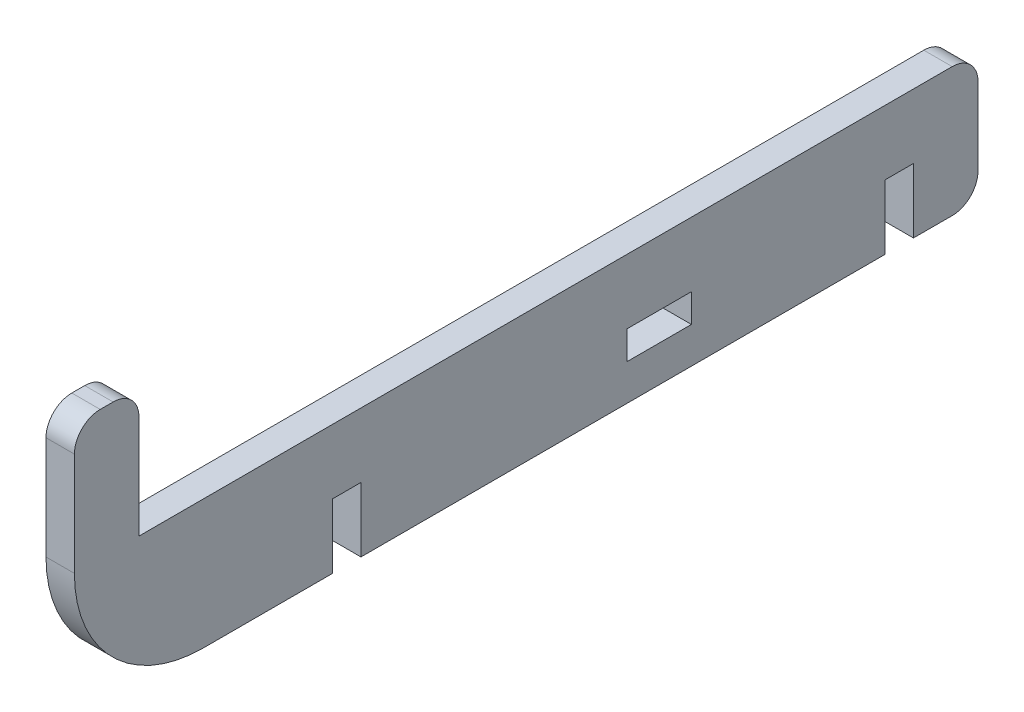
ISO-10303-21;
HEADER;
FILE_DESCRIPTION(('STEP AP214'),'2;1');
FILE_NAME('part.step','',(''),(''),'','','');
FILE_SCHEMA(('AUTOMOTIVE_DESIGN { 1 0 10303 214 1 1 1 1 }'));
ENDSEC;
DATA;
#1=APPLICATION_CONTEXT('core data for automotive mechanical design processes');
#2=APPLICATION_PROTOCOL_DEFINITION('international standard','automotive_design',2000,#1);
#3=PRODUCT_CONTEXT('',#1,'mechanical');
#4=PRODUCT('Part','Part','',(#3));
#5=PRODUCT_RELATED_PRODUCT_CATEGORY('part','',(#4));
#6=PRODUCT_DEFINITION_FORMATION('','',#4);
#7=PRODUCT_DEFINITION_CONTEXT('part definition',#1,'design');
#8=PRODUCT_DEFINITION('design','',#6,#7);
#9=PRODUCT_DEFINITION_SHAPE('','',#8);
#10=(LENGTH_UNIT() NAMED_UNIT(*) SI_UNIT(.MILLI.,.METRE.));
#11=(NAMED_UNIT(*) PLANE_ANGLE_UNIT() SI_UNIT($,.RADIAN.));
#12=(NAMED_UNIT(*) SI_UNIT($,.STERADIAN.) SOLID_ANGLE_UNIT());
#13=UNCERTAINTY_MEASURE_WITH_UNIT(LENGTH_MEASURE(1.E-05),#10,'distance_accuracy_value','');
#14=(GEOMETRIC_REPRESENTATION_CONTEXT(3) GLOBAL_UNCERTAINTY_ASSIGNED_CONTEXT((#13)) GLOBAL_UNIT_ASSIGNED_CONTEXT((#10,
#11,#12)) REPRESENTATION_CONTEXT('',''));
#15=CARTESIAN_POINT('',(0.,0.,0.));
#16=DIRECTION('',(0.,0.,1.));
#17=DIRECTION('',(1.,0.,0.));
#18=AXIS2_PLACEMENT_3D('',#15,#16,#17);
#19=CARTESIAN_POINT('',(2.794,0.,0.));
#20=DIRECTION('',(0.,1.,0.));
#21=DIRECTION('',(0.,0.,1.));
#22=AXIS2_PLACEMENT_3D('',#19,#20,#21);
#23=PLANE('',#22);
#24=DIRECTION('',(0.,0.,-1.));
#25=VECTOR('',#24,1.);
#26=CARTESIAN_POINT('',(0.,0.,0.));
#27=LINE('',#26,#25);
#28=CARTESIAN_POINT('',(0.,0.,-28.194));
#29=VERTEX_POINT('',#28);
#30=CARTESIAN_POINT('',(0.,0.,-79.756));
#31=VERTEX_POINT('',#30);
#32=EDGE_CURVE('E304',#29,#31,#27,.T.);
#33=ORIENTED_EDGE('',*,*,#32,.T.);
#34=DIRECTION('',(-1.,0.,0.));
#35=VECTOR('',#34,1.);
#36=CARTESIAN_POINT('',(2.794,0.,-79.756));
#37=LINE('',#36,#35);
#38=CARTESIAN_POINT('',(2.794,0.,-79.756));
#39=VERTEX_POINT('',#38);
#40=EDGE_CURVE('E240',#39,#31,#37,.T.);
#41=ORIENTED_EDGE('',*,*,#40,.F.);
#42=DIRECTION('',(0.,0.,-1.));
#43=VECTOR('',#42,1.);
#44=CARTESIAN_POINT('',(2.794,0.,0.));
#45=LINE('',#44,#43);
#46=CARTESIAN_POINT('',(2.794,0.,-28.194));
#47=VERTEX_POINT('',#46);
#48=EDGE_CURVE('E285',#47,#39,#45,.T.);
#49=ORIENTED_EDGE('',*,*,#48,.F.);
#50=DIRECTION('',(-1.,0.,0.));
#51=VECTOR('',#50,1.);
#52=CARTESIAN_POINT('',(2.794,0.,-28.194));
#53=LINE('',#52,#51);
#54=EDGE_CURVE('E267',#47,#29,#53,.T.);
#55=ORIENTED_EDGE('',*,*,#54,.T.);
#56=EDGE_LOOP('',(#33,#41,#49,#55));
#57=FACE_BOUND('',#56,.T.);
#58=ADVANCED_FACE('F33',(#57),#23,.F.);
#59=CARTESIAN_POINT('',(2.794,0.,-82.55));
#60=VERTEX_POINT('',#59);
#61=CARTESIAN_POINT('',(2.794,0.,-86.36));
#62=VERTEX_POINT('',#61);
#63=EDGE_CURVE('E279',#60,#62,#45,.T.);
#64=ORIENTED_EDGE('',*,*,#63,.F.);
#65=DIRECTION('',(-1.,0.,0.));
#66=VECTOR('',#65,1.);
#67=CARTESIAN_POINT('',(2.794,0.,-82.55));
#68=LINE('',#67,#66);
#69=CARTESIAN_POINT('',(0.,0.,-82.55));
#70=VERTEX_POINT('',#69);
#71=EDGE_CURVE('E243',#60,#70,#68,.T.);
#72=ORIENTED_EDGE('',*,*,#71,.T.);
#73=CARTESIAN_POINT('',(0.,0.,-86.36));
#74=VERTEX_POINT('',#73);
#75=EDGE_CURVE('E299',#70,#74,#27,.T.);
#76=ORIENTED_EDGE('',*,*,#75,.T.);
#77=DIRECTION('',(-1.,0.,0.));
#78=VECTOR('',#77,1.);
#79=CARTESIAN_POINT('',(2.794,0.,-86.36));
#80=LINE('',#79,#78);
#81=EDGE_CURVE('E330',#74,#62,#80,.F.);
#82=ORIENTED_EDGE('',*,*,#81,.T.);
#83=EDGE_LOOP('',(#64,#72,#76,#82));
#84=FACE_BOUND('',#83,.T.);
#85=ADVANCED_FACE('F397',(#84),#23,.F.);
#86=CARTESIAN_POINT('',(2.794,25.4,0.));
#87=DIRECTION('',(0.,0.,-1.));
#88=DIRECTION('',(-1.,0.,0.));
#89=AXIS2_PLACEMENT_3D('',#86,#87,#88);
#90=PLANE('',#89);
#91=DIRECTION('',(0.,-1.,0.));
#92=VECTOR('',#91,1.);
#93=CARTESIAN_POINT('',(0.,25.4,0.));
#94=LINE('',#93,#92);
#95=CARTESIAN_POINT('',(0.,22.86,0.));
#96=VERTEX_POINT('',#95);
#97=CARTESIAN_POINT('',(0.,12.7,0.));
#98=VERTEX_POINT('',#97);
#99=EDGE_CURVE('E270',#96,#98,#94,.T.);
#100=ORIENTED_EDGE('',*,*,#99,.T.);
#101=DIRECTION('',(-1.,0.,0.));
#102=VECTOR('',#101,1.);
#103=CARTESIAN_POINT('',(2.794,12.7,0.));
#104=LINE('',#103,#102);
#105=CARTESIAN_POINT('',(2.794,12.7,0.));
#106=VERTEX_POINT('',#105);
#107=EDGE_CURVE('E41',#98,#106,#104,.F.);
#108=ORIENTED_EDGE('',*,*,#107,.T.);
#109=DIRECTION('',(0.,-1.,0.));
#110=VECTOR('',#109,1.);
#111=CARTESIAN_POINT('',(2.794,25.4,0.));
#112=LINE('',#111,#110);
#113=CARTESIAN_POINT('',(2.794,22.86,0.));
#114=VERTEX_POINT('',#113);
#115=EDGE_CURVE('E276',#114,#106,#112,.T.);
#116=ORIENTED_EDGE('',*,*,#115,.F.);
#117=DIRECTION('',(-1.,0.,0.));
#118=VECTOR('',#117,1.);
#119=CARTESIAN_POINT('',(2.794,22.86,0.));
#120=LINE('',#119,#118);
#121=EDGE_CURVE('E351',#114,#96,#120,.T.);
#122=ORIENTED_EDGE('',*,*,#121,.T.);
#123=EDGE_LOOP('',(#100,#108,#116,#122));
#124=FACE_BOUND('',#123,.T.);
#125=ADVANCED_FACE('F361',(#124),#90,.F.);
#126=CARTESIAN_POINT('',(0.,0.,-12.7));
#127=VERTEX_POINT('',#126);
#128=CARTESIAN_POINT('',(0.,0.,-25.4));
#129=VERTEX_POINT('',#128);
#130=EDGE_CURVE('E300',#127,#129,#27,.T.);
#131=ORIENTED_EDGE('',*,*,#130,.T.);
#132=DIRECTION('',(-1.,0.,0.));
#133=VECTOR('',#132,1.);
#134=CARTESIAN_POINT('',(2.794,0.,-25.4));
#135=LINE('',#134,#133);
#136=CARTESIAN_POINT('',(2.794,0.,-25.4));
#137=VERTEX_POINT('',#136);
#138=EDGE_CURVE('E260',#137,#129,#135,.T.);
#139=ORIENTED_EDGE('',*,*,#138,.F.);
#140=CARTESIAN_POINT('',(2.794,0.,-12.7));
#141=VERTEX_POINT('',#140);
#142=EDGE_CURVE('E281',#141,#137,#45,.T.);
#143=ORIENTED_EDGE('',*,*,#142,.F.);
#144=DIRECTION('',(-1.,0.,0.));
#145=VECTOR('',#144,1.);
#146=CARTESIAN_POINT('',(2.794,0.,-12.7));
#147=LINE('',#146,#145);
#148=EDGE_CURVE('E354',#141,#127,#147,.T.);
#149=ORIENTED_EDGE('',*,*,#148,.T.);
#150=EDGE_LOOP('',(#131,#139,#143,#149));
#151=FACE_BOUND('',#150,.T.);
#152=ADVANCED_FACE('F371',(#151),#23,.F.);
#153=CARTESIAN_POINT('',(2.794,0.,-88.9));
#154=DIRECTION('',(0.,0.,1.));
#155=DIRECTION('',(1.,0.,0.));
#156=AXIS2_PLACEMENT_3D('',#153,#154,#155);
#157=PLANE('',#156);
#158=DIRECTION('',(0.,1.,0.));
#159=VECTOR('',#158,1.);
#160=CARTESIAN_POINT('',(2.794,0.,-88.9));
#161=LINE('',#160,#159);
#162=CARTESIAN_POINT('',(2.794,2.54,-88.9));
#163=VERTEX_POINT('',#162);
#164=CARTESIAN_POINT('',(2.794,10.16,-88.9));
#165=VERTEX_POINT('',#164);
#166=EDGE_CURVE('E284',#163,#165,#161,.T.);
#167=ORIENTED_EDGE('',*,*,#166,.F.);
#168=DIRECTION('',(-1.,0.,0.));
#169=VECTOR('',#168,1.);
#170=CARTESIAN_POINT('',(2.794,2.54,-88.9));
#171=LINE('',#170,#169);
#172=CARTESIAN_POINT('',(0.,2.54,-88.9));
#173=VERTEX_POINT('',#172);
#174=EDGE_CURVE('E318',#163,#173,#171,.T.);
#175=ORIENTED_EDGE('',*,*,#174,.T.);
#176=DIRECTION('',(0.,1.,0.));
#177=VECTOR('',#176,1.);
#178=CARTESIAN_POINT('',(0.,0.,-88.9));
#179=LINE('',#178,#177);
#180=CARTESIAN_POINT('',(0.,10.16,-88.9));
#181=VERTEX_POINT('',#180);
#182=EDGE_CURVE('E303',#173,#181,#179,.T.);
#183=ORIENTED_EDGE('',*,*,#182,.T.);
#184=DIRECTION('',(-1.,0.,0.));
#185=VECTOR('',#184,1.);
#186=CARTESIAN_POINT('',(2.794,10.16,-88.9));
#187=LINE('',#186,#185);
#188=EDGE_CURVE('E316',#181,#165,#187,.F.);
#189=ORIENTED_EDGE('',*,*,#188,.T.);
#190=EDGE_LOOP('',(#167,#175,#183,#189));
#191=FACE_BOUND('',#190,.T.);
#192=ADVANCED_FACE('F408',(#191),#157,.F.);
#193=CARTESIAN_POINT('',(2.794,12.7,-88.9));
#194=DIRECTION('',(0.,-1.,0.));
#195=DIRECTION('',(0.,0.,-1.));
#196=AXIS2_PLACEMENT_3D('',#193,#194,#195);
#197=PLANE('',#196);
#198=DIRECTION('',(0.,0.,1.));
#199=VECTOR('',#198,1.);
#200=CARTESIAN_POINT('',(2.794,12.7,-88.9));
#201=LINE('',#200,#199);
#202=CARTESIAN_POINT('',(2.794,12.7,-86.36));
#203=VERTEX_POINT('',#202);
#204=CARTESIAN_POINT('',(2.794,12.7,-6.35));
#205=VERTEX_POINT('',#204);
#206=EDGE_CURVE('E288',#203,#205,#201,.T.);
#207=ORIENTED_EDGE('',*,*,#206,.F.);
#208=DIRECTION('',(-1.,0.,0.));
#209=VECTOR('',#208,1.);
#210=CARTESIAN_POINT('',(2.794,12.7,-86.36));
#211=LINE('',#210,#209);
#212=CARTESIAN_POINT('',(0.,12.7,-86.36));
#213=VERTEX_POINT('',#212);
#214=EDGE_CURVE('E341',#203,#213,#211,.T.);
#215=ORIENTED_EDGE('',*,*,#214,.T.);
#216=DIRECTION('',(0.,0.,1.));
#217=VECTOR('',#216,1.);
#218=CARTESIAN_POINT('',(0.,12.7,-88.9));
#219=LINE('',#218,#217);
#220=CARTESIAN_POINT('',(0.,12.7,-6.35));
#221=VERTEX_POINT('',#220);
#222=EDGE_CURVE('E307',#213,#221,#219,.T.);
#223=ORIENTED_EDGE('',*,*,#222,.T.);
#224=DIRECTION('',(-1.,0.,0.));
#225=VECTOR('',#224,1.);
#226=CARTESIAN_POINT('',(2.794,12.7,-6.35));
#227=LINE('',#226,#225);
#228=EDGE_CURVE('E296',#205,#221,#227,.T.);
#229=ORIENTED_EDGE('',*,*,#228,.F.);
#230=EDGE_LOOP('',(#207,#215,#223,#229));
#231=FACE_BOUND('',#230,.T.);
#232=ADVANCED_FACE('F416',(#231),#197,.F.);
#233=CARTESIAN_POINT('',(2.794,12.7,-6.35));
#234=DIRECTION('',(0.,0.,1.));
#235=DIRECTION('',(0.,-1.,0.));
#236=AXIS2_PLACEMENT_3D('',#233,#234,#235);
#237=PLANE('',#236);
#238=DIRECTION('',(0.,1.,0.));
#239=VECTOR('',#238,1.);
#240=CARTESIAN_POINT('',(0.,12.7,-6.35));
#241=LINE('',#240,#239);
#242=CARTESIAN_POINT('',(0.,22.86,-6.35));
#243=VERTEX_POINT('',#242);
#244=EDGE_CURVE('E309',#221,#243,#241,.T.);
#245=ORIENTED_EDGE('',*,*,#244,.T.);
#246=DIRECTION('',(-1.,0.,0.));
#247=VECTOR('',#246,1.);
#248=CARTESIAN_POINT('',(2.794,22.86,-6.35));
#249=LINE('',#248,#247);
#250=CARTESIAN_POINT('',(2.794,22.86,-6.35));
#251=VERTEX_POINT('',#250);
#252=EDGE_CURVE('E349',#243,#251,#249,.F.);
#253=ORIENTED_EDGE('',*,*,#252,.T.);
#254=DIRECTION('',(0.,1.,0.));
#255=VECTOR('',#254,1.);
#256=CARTESIAN_POINT('',(2.794,12.7,-6.35));
#257=LINE('',#256,#255);
#258=EDGE_CURVE('E290',#205,#251,#257,.T.);
#259=ORIENTED_EDGE('',*,*,#258,.F.);
#260=ORIENTED_EDGE('',*,*,#228,.T.);
#261=EDGE_LOOP('',(#245,#253,#259,#260));
#262=FACE_BOUND('',#261,.T.);
#263=ADVANCED_FACE('F421',(#262),#237,.F.);
#264=CARTESIAN_POINT('',(2.794,25.4,-6.35));
#265=DIRECTION('',(0.,-1.,0.));
#266=DIRECTION('',(0.,0.,-1.));
#267=AXIS2_PLACEMENT_3D('',#264,#265,#266);
#268=PLANE('',#267);
#269=DIRECTION('',(0.,0.,1.));
#270=VECTOR('',#269,1.);
#271=CARTESIAN_POINT('',(2.794,25.4,-6.35));
#272=LINE('',#271,#270);
#273=CARTESIAN_POINT('',(2.794,25.4,-3.81));
#274=VERTEX_POINT('',#273);
#275=CARTESIAN_POINT('',(2.794,25.4,-2.54));
#276=VERTEX_POINT('',#275);
#277=EDGE_CURVE('E293',#274,#276,#272,.T.);
#278=ORIENTED_EDGE('',*,*,#277,.F.);
#279=DIRECTION('',(-1.,0.,0.));
#280=VECTOR('',#279,1.);
#281=CARTESIAN_POINT('',(2.794,25.4,-3.81));
#282=LINE('',#281,#280);
#283=CARTESIAN_POINT('',(0.,25.4,-3.81));
#284=VERTEX_POINT('',#283);
#285=EDGE_CURVE('E346',#274,#284,#282,.T.);
#286=ORIENTED_EDGE('',*,*,#285,.T.);
#287=DIRECTION('',(0.,0.,1.));
#288=VECTOR('',#287,1.);
#289=CARTESIAN_POINT('',(0.,25.4,-6.35));
#290=LINE('',#289,#288);
#291=CARTESIAN_POINT('',(0.,25.4,-2.54));
#292=VERTEX_POINT('',#291);
#293=EDGE_CURVE('E280',#284,#292,#290,.T.);
#294=ORIENTED_EDGE('',*,*,#293,.T.);
#295=DIRECTION('',(-1.,0.,0.));
#296=VECTOR('',#295,1.);
#297=CARTESIAN_POINT('',(2.794,25.4,-2.54));
#298=LINE('',#297,#296);
#299=EDGE_CURVE('E344',#292,#276,#298,.F.);
#300=ORIENTED_EDGE('',*,*,#299,.T.);
#301=EDGE_LOOP('',(#278,#286,#294,#300));
#302=FACE_BOUND('',#301,.T.);
#303=ADVANCED_FACE('F430',(#302),#268,.F.);
#304=CARTESIAN_POINT('',(2.794,0.,0.));
#305=DIRECTION('',(1.,0.,0.));
#306=DIRECTION('',(0.,0.,-1.));
#307=AXIS2_PLACEMENT_3D('',#304,#305,#306);
#308=PLANE('',#307);
#309=DIRECTION('',(0.,-1.,0.));
#310=VECTOR('',#309,1.);
#311=CARTESIAN_POINT('',(2.794,6.35,-60.706));
#312=LINE('',#311,#310);
#313=CARTESIAN_POINT('',(2.794,6.35,-60.706));
#314=VERTEX_POINT('',#313);
#315=CARTESIAN_POINT('',(2.794,3.556,-60.706));
#316=VERTEX_POINT('',#315);
#317=EDGE_CURVE('E189',#314,#316,#312,.T.);
#318=ORIENTED_EDGE('',*,*,#317,.T.);
#319=DIRECTION('',(0.,0.,1.));
#320=VECTOR('',#319,1.);
#321=CARTESIAN_POINT('',(2.794,3.556,-60.706));
#322=LINE('',#321,#320);
#323=CARTESIAN_POINT('',(2.794,3.556,-54.356));
#324=VERTEX_POINT('',#323);
#325=EDGE_CURVE('E198',#316,#324,#322,.T.);
#326=ORIENTED_EDGE('',*,*,#325,.T.);
#327=DIRECTION('',(0.,1.,0.));
#328=VECTOR('',#327,1.);
#329=CARTESIAN_POINT('',(2.794,3.556,-54.356));
#330=LINE('',#329,#328);
#331=CARTESIAN_POINT('',(2.794,6.35,-54.356));
#332=VERTEX_POINT('',#331);
#333=EDGE_CURVE('E48',#324,#332,#330,.T.);
#334=ORIENTED_EDGE('',*,*,#333,.T.);
#335=DIRECTION('',(0.,0.,-1.));
#336=VECTOR('',#335,1.);
#337=CARTESIAN_POINT('',(2.794,6.35,-54.356));
#338=LINE('',#337,#336);
#339=EDGE_CURVE('E195',#332,#314,#338,.T.);
#340=ORIENTED_EDGE('',*,*,#339,.T.);
#341=EDGE_LOOP('',(#318,#326,#334,#340));
#342=FACE_BOUND('',#341,.T.);
#343=DIRECTION('',(0.,1.,0.));
#344=VECTOR('',#343,1.);
#345=CARTESIAN_POINT('',(2.794,0.,-79.756));
#346=LINE('',#345,#344);
#347=CARTESIAN_POINT('',(2.794,6.34999999999999,-79.756));
#348=VERTEX_POINT('',#347);
#349=EDGE_CURVE('E224',#39,#348,#346,.T.);
#350=ORIENTED_EDGE('',*,*,#349,.T.);
#351=DIRECTION('',(0.,0.,-1.));
#352=VECTOR('',#351,1.);
#353=CARTESIAN_POINT('',(2.794,6.34999999999999,-79.756));
#354=LINE('',#353,#352);
#355=CARTESIAN_POINT('',(2.794,6.34999999999998,-82.55));
#356=VERTEX_POINT('',#355);
#357=EDGE_CURVE('E227',#348,#356,#354,.T.);
#358=ORIENTED_EDGE('',*,*,#357,.T.);
#359=DIRECTION('',(0.,-1.,0.));
#360=VECTOR('',#359,1.);
#361=CARTESIAN_POINT('',(2.794,0.,-82.55));
#362=LINE('',#361,#360);
#363=EDGE_CURVE('E231',#356,#60,#362,.T.);
#364=ORIENTED_EDGE('',*,*,#363,.T.);
#365=ORIENTED_EDGE('',*,*,#63,.T.);
#366=CARTESIAN_POINT('',(2.794,2.54,-86.36));
#367=DIRECTION('',(1.,0.,0.));
#368=DIRECTION('',(0.,0.,-1.));
#369=AXIS2_PLACEMENT_3D('',#366,#367,#368);
#370=CIRCLE('',#369,2.54);
#371=EDGE_CURVE('E339',#62,#163,#370,.T.);
#372=ORIENTED_EDGE('',*,*,#371,.T.);
#373=ORIENTED_EDGE('',*,*,#166,.T.);
#374=CARTESIAN_POINT('',(2.794,10.16,-86.36));
#375=DIRECTION('',(1.,0.,0.));
#376=DIRECTION('',(0.,0.,-1.));
#377=AXIS2_PLACEMENT_3D('',#374,#375,#376);
#378=CIRCLE('',#377,2.54);
#379=EDGE_CURVE('E337',#165,#203,#378,.T.);
#380=ORIENTED_EDGE('',*,*,#379,.T.);
#381=ORIENTED_EDGE('',*,*,#206,.T.);
#382=ORIENTED_EDGE('',*,*,#258,.T.);
#383=CARTESIAN_POINT('',(2.794,22.86,-3.81));
#384=DIRECTION('',(1.,0.,0.));
#385=DIRECTION('',(0.,0.,-1.));
#386=AXIS2_PLACEMENT_3D('',#383,#384,#385);
#387=CIRCLE('',#386,2.54);
#388=EDGE_CURVE('E335',#251,#274,#387,.T.);
#389=ORIENTED_EDGE('',*,*,#388,.T.);
#390=ORIENTED_EDGE('',*,*,#277,.T.);
#391=CARTESIAN_POINT('',(2.794,22.86,-2.54));
#392=DIRECTION('',(1.,0.,0.));
#393=DIRECTION('',(0.,0.,-1.));
#394=AXIS2_PLACEMENT_3D('',#391,#392,#393);
#395=CIRCLE('',#394,2.54);
#396=EDGE_CURVE('E333',#276,#114,#395,.T.);
#397=ORIENTED_EDGE('',*,*,#396,.T.);
#398=ORIENTED_EDGE('',*,*,#115,.T.);
#399=CARTESIAN_POINT('',(2.794,12.7,-12.7));
#400=DIRECTION('',(1.,0.,0.));
#401=DIRECTION('',(0.,0.,-1.));
#402=AXIS2_PLACEMENT_3D('',#399,#400,#401);
#403=CIRCLE('',#402,12.7);
#404=EDGE_CURVE('E11',#106,#141,#403,.T.);
#405=ORIENTED_EDGE('',*,*,#404,.T.);
#406=ORIENTED_EDGE('',*,*,#142,.T.);
#407=DIRECTION('',(0.,1.,0.));
#408=VECTOR('',#407,1.);
#409=CARTESIAN_POINT('',(2.794,0.,-25.4));
#410=LINE('',#409,#408);
#411=CARTESIAN_POINT('',(2.794,6.35,-25.4));
#412=VERTEX_POINT('',#411);
#413=EDGE_CURVE('E250',#137,#412,#410,.T.);
#414=ORIENTED_EDGE('',*,*,#413,.T.);
#415=DIRECTION('',(0.,0.,-1.));
#416=VECTOR('',#415,1.);
#417=CARTESIAN_POINT('',(2.794,6.35,-28.194));
#418=LINE('',#417,#416);
#419=CARTESIAN_POINT('',(2.794,6.35,-28.194));
#420=VERTEX_POINT('',#419);
#421=EDGE_CURVE('E253',#412,#420,#418,.T.);
#422=ORIENTED_EDGE('',*,*,#421,.T.);
#423=DIRECTION('',(0.,-1.,0.));
#424=VECTOR('',#423,1.);
#425=CARTESIAN_POINT('',(2.794,0.,-28.194));
#426=LINE('',#425,#424);
#427=EDGE_CURVE('E257',#420,#47,#426,.T.);
#428=ORIENTED_EDGE('',*,*,#427,.T.);
#429=ORIENTED_EDGE('',*,*,#48,.T.);
#430=EDGE_LOOP('',(#350,#358,#364,#365,#372,#373,#380,#381,#382,#389,#390,#397,#398,#405,#406,
#414,#422,#428,#429));
#431=FACE_BOUND('',#430,.T.);
#432=ADVANCED_FACE('F202',(#342,#431),#308,.T.);
#433=CARTESIAN_POINT('',(0.,0.,0.));
#434=DIRECTION('',(1.,0.,0.));
#435=DIRECTION('',(0.,0.,-1.));
#436=AXIS2_PLACEMENT_3D('',#433,#434,#435);
#437=PLANE('',#436);
#438=DIRECTION('',(0.,0.,1.));
#439=VECTOR('',#438,1.);
#440=CARTESIAN_POINT('',(0.,3.556,-60.706));
#441=LINE('',#440,#439);
#442=CARTESIAN_POINT('',(0.,3.556,-60.706));
#443=VERTEX_POINT('',#442);
#444=CARTESIAN_POINT('',(0.,3.556,-54.356));
#445=VERTEX_POINT('',#444);
#446=EDGE_CURVE('E214',#443,#445,#441,.T.);
#447=ORIENTED_EDGE('',*,*,#446,.F.);
#448=DIRECTION('',(0.,-1.,0.));
#449=VECTOR('',#448,1.);
#450=CARTESIAN_POINT('',(0.,6.35,-60.706));
#451=LINE('',#450,#449);
#452=CARTESIAN_POINT('',(0.,6.35,-60.706));
#453=VERTEX_POINT('',#452);
#454=EDGE_CURVE('E56',#453,#443,#451,.T.);
#455=ORIENTED_EDGE('',*,*,#454,.F.);
#456=DIRECTION('',(0.,0.,-1.));
#457=VECTOR('',#456,1.);
#458=CARTESIAN_POINT('',(0.,6.35,-54.356));
#459=LINE('',#458,#457);
#460=CARTESIAN_POINT('',(0.,6.35,-54.356));
#461=VERTEX_POINT('',#460);
#462=EDGE_CURVE('E205',#461,#453,#459,.T.);
#463=ORIENTED_EDGE('',*,*,#462,.F.);
#464=DIRECTION('',(0.,1.,0.));
#465=VECTOR('',#464,1.);
#466=CARTESIAN_POINT('',(0.,3.556,-54.356));
#467=LINE('',#466,#465);
#468=EDGE_CURVE('E208',#445,#461,#467,.T.);
#469=ORIENTED_EDGE('',*,*,#468,.F.);
#470=EDGE_LOOP('',(#447,#455,#463,#469));
#471=FACE_BOUND('',#470,.T.);
#472=DIRECTION('',(0.,0.,-1.));
#473=VECTOR('',#472,1.);
#474=CARTESIAN_POINT('',(0.,6.34999999999999,-79.756));
#475=LINE('',#474,#473);
#476=CARTESIAN_POINT('',(0.,6.34999999999999,-79.756));
#477=VERTEX_POINT('',#476);
#478=CARTESIAN_POINT('',(0.,6.34999999999998,-82.55));
#479=VERTEX_POINT('',#478);
#480=EDGE_CURVE('E236',#477,#479,#475,.T.);
#481=ORIENTED_EDGE('',*,*,#480,.F.);
#482=DIRECTION('',(0.,1.,0.));
#483=VECTOR('',#482,1.);
#484=CARTESIAN_POINT('',(0.,0.,-79.756));
#485=LINE('',#484,#483);
#486=EDGE_CURVE('E220',#31,#477,#485,.T.);
#487=ORIENTED_EDGE('',*,*,#486,.F.);
#488=ORIENTED_EDGE('',*,*,#32,.F.);
#489=DIRECTION('',(0.,-1.,0.));
#490=VECTOR('',#489,1.);
#491=CARTESIAN_POINT('',(0.,0.,-28.194));
#492=LINE('',#491,#490);
#493=CARTESIAN_POINT('',(0.,6.35,-28.194));
#494=VERTEX_POINT('',#493);
#495=EDGE_CURVE('E254',#494,#29,#492,.T.);
#496=ORIENTED_EDGE('',*,*,#495,.F.);
#497=DIRECTION('',(0.,0.,-1.));
#498=VECTOR('',#497,1.);
#499=CARTESIAN_POINT('',(0.,6.35,-28.194));
#500=LINE('',#499,#498);
#501=CARTESIAN_POINT('',(0.,6.35,-25.4));
#502=VERTEX_POINT('',#501);
#503=EDGE_CURVE('E263',#502,#494,#500,.T.);
#504=ORIENTED_EDGE('',*,*,#503,.F.);
#505=DIRECTION('',(0.,1.,0.));
#506=VECTOR('',#505,1.);
#507=CARTESIAN_POINT('',(0.,0.,-25.4));
#508=LINE('',#507,#506);
#509=EDGE_CURVE('E242',#129,#502,#508,.T.);
#510=ORIENTED_EDGE('',*,*,#509,.F.);
#511=ORIENTED_EDGE('',*,*,#130,.F.);
#512=CARTESIAN_POINT('',(0.,12.7,-12.7));
#513=DIRECTION('',(1.,0.,0.));
#514=DIRECTION('',(0.,0.,-1.));
#515=AXIS2_PLACEMENT_3D('',#512,#513,#514);
#516=CIRCLE('',#515,12.7);
#517=EDGE_CURVE('E357',#127,#98,#516,.F.);
#518=ORIENTED_EDGE('',*,*,#517,.T.);
#519=ORIENTED_EDGE('',*,*,#99,.F.);
#520=CARTESIAN_POINT('',(0.,22.86,-2.54));
#521=DIRECTION('',(1.,0.,0.));
#522=DIRECTION('',(0.,0.,-1.));
#523=AXIS2_PLACEMENT_3D('',#520,#521,#522);
#524=CIRCLE('',#523,2.54);
#525=EDGE_CURVE('E321',#96,#292,#524,.F.);
#526=ORIENTED_EDGE('',*,*,#525,.T.);
#527=ORIENTED_EDGE('',*,*,#293,.F.);
#528=CARTESIAN_POINT('',(0.,22.86,-3.81));
#529=DIRECTION('',(1.,0.,0.));
#530=DIRECTION('',(0.,0.,-1.));
#531=AXIS2_PLACEMENT_3D('',#528,#529,#530);
#532=CIRCLE('',#531,2.54);
#533=EDGE_CURVE('E323',#284,#243,#532,.F.);
#534=ORIENTED_EDGE('',*,*,#533,.T.);
#535=ORIENTED_EDGE('',*,*,#244,.F.);
#536=ORIENTED_EDGE('',*,*,#222,.F.);
#537=CARTESIAN_POINT('',(0.,10.16,-86.36));
#538=DIRECTION('',(1.,0.,0.));
#539=DIRECTION('',(0.,0.,-1.));
#540=AXIS2_PLACEMENT_3D('',#537,#538,#539);
#541=CIRCLE('',#540,2.54);
#542=EDGE_CURVE('E325',#213,#181,#541,.F.);
#543=ORIENTED_EDGE('',*,*,#542,.T.);
#544=ORIENTED_EDGE('',*,*,#182,.F.);
#545=CARTESIAN_POINT('',(0.,2.54,-86.36));
#546=DIRECTION('',(1.,0.,0.));
#547=DIRECTION('',(0.,0.,-1.));
#548=AXIS2_PLACEMENT_3D('',#545,#546,#547);
#549=CIRCLE('',#548,2.54);
#550=EDGE_CURVE('E327',#173,#74,#549,.F.);
#551=ORIENTED_EDGE('',*,*,#550,.T.);
#552=ORIENTED_EDGE('',*,*,#75,.F.);
#553=DIRECTION('',(0.,-1.,0.));
#554=VECTOR('',#553,1.);
#555=CARTESIAN_POINT('',(0.,0.,-82.55));
#556=LINE('',#555,#554);
#557=EDGE_CURVE('E228',#479,#70,#556,.T.);
#558=ORIENTED_EDGE('',*,*,#557,.F.);
#559=EDGE_LOOP('',(#481,#487,#488,#496,#504,#510,#511,#518,#519,#526,#527,#534,#535,#536,#543,
#544,#551,#552,#558));
#560=FACE_BOUND('',#559,.T.);
#561=ADVANCED_FACE('F376',(#471,#560),#437,.F.);
#562=CARTESIAN_POINT('',(2.794,2.54,-86.36));
#563=DIRECTION('',(-1.,0.,0.));
#564=DIRECTION('',(0.,0.,1.));
#565=AXIS2_PLACEMENT_3D('',#562,#563,#564);
#566=CYLINDRICAL_SURFACE('',#565,2.54);
#567=ORIENTED_EDGE('',*,*,#371,.F.);
#568=ORIENTED_EDGE('',*,*,#81,.F.);
#569=ORIENTED_EDGE('',*,*,#550,.F.);
#570=ORIENTED_EDGE('',*,*,#174,.F.);
#571=EDGE_LOOP('',(#567,#568,#569,#570));
#572=FACE_BOUND('',#571,.T.);
#573=ADVANCED_FACE('F404',(#572),#566,.T.);
#574=CARTESIAN_POINT('',(2.794,10.16,-86.36));
#575=DIRECTION('',(-1.,0.,0.));
#576=DIRECTION('',(0.,0.,1.));
#577=AXIS2_PLACEMENT_3D('',#574,#575,#576);
#578=CYLINDRICAL_SURFACE('',#577,2.54);
#579=ORIENTED_EDGE('',*,*,#379,.F.);
#580=ORIENTED_EDGE('',*,*,#188,.F.);
#581=ORIENTED_EDGE('',*,*,#542,.F.);
#582=ORIENTED_EDGE('',*,*,#214,.F.);
#583=EDGE_LOOP('',(#579,#580,#581,#582));
#584=FACE_BOUND('',#583,.T.);
#585=ADVANCED_FACE('F411',(#584),#578,.T.);
#586=CARTESIAN_POINT('',(2.794,22.86,-3.81));
#587=DIRECTION('',(-1.,0.,0.));
#588=DIRECTION('',(0.,0.,1.));
#589=AXIS2_PLACEMENT_3D('',#586,#587,#588);
#590=CYLINDRICAL_SURFACE('',#589,2.54);
#591=ORIENTED_EDGE('',*,*,#388,.F.);
#592=ORIENTED_EDGE('',*,*,#252,.F.);
#593=ORIENTED_EDGE('',*,*,#533,.F.);
#594=ORIENTED_EDGE('',*,*,#285,.F.);
#595=EDGE_LOOP('',(#591,#592,#593,#594));
#596=FACE_BOUND('',#595,.T.);
#597=ADVANCED_FACE('F427',(#596),#590,.T.);
#598=CARTESIAN_POINT('',(2.794,22.86,-2.54));
#599=DIRECTION('',(-1.,0.,0.));
#600=DIRECTION('',(0.,0.,1.));
#601=AXIS2_PLACEMENT_3D('',#598,#599,#600);
#602=CYLINDRICAL_SURFACE('',#601,2.54);
#603=ORIENTED_EDGE('',*,*,#396,.F.);
#604=ORIENTED_EDGE('',*,*,#299,.F.);
#605=ORIENTED_EDGE('',*,*,#525,.F.);
#606=ORIENTED_EDGE('',*,*,#121,.F.);
#607=EDGE_LOOP('',(#603,#604,#605,#606));
#608=FACE_BOUND('',#607,.T.);
#609=ADVANCED_FACE('F433',(#608),#602,.T.);
#610=CARTESIAN_POINT('',(2.794,12.7,-12.7));
#611=DIRECTION('',(-1.,0.,0.));
#612=DIRECTION('',(0.,0.,1.));
#613=AXIS2_PLACEMENT_3D('',#610,#611,#612);
#614=CYLINDRICAL_SURFACE('',#613,12.7);
#615=ORIENTED_EDGE('',*,*,#404,.F.);
#616=ORIENTED_EDGE('',*,*,#107,.F.);
#617=ORIENTED_EDGE('',*,*,#517,.F.);
#618=ORIENTED_EDGE('',*,*,#148,.F.);
#619=EDGE_LOOP('',(#615,#616,#617,#618));
#620=FACE_BOUND('',#619,.T.);
#621=ADVANCED_FACE('F35',(#620),#614,.T.);
#622=CARTESIAN_POINT('',(2.794,0.,-28.194));
#623=DIRECTION('',(0.,0.,-1.));
#624=DIRECTION('',(-1.,0.,0.));
#625=AXIS2_PLACEMENT_3D('',#622,#623,#624);
#626=PLANE('',#625);
#627=ORIENTED_EDGE('',*,*,#495,.T.);
#628=ORIENTED_EDGE('',*,*,#54,.F.);
#629=ORIENTED_EDGE('',*,*,#427,.F.);
#630=DIRECTION('',(-1.,0.,0.));
#631=VECTOR('',#630,1.);
#632=CARTESIAN_POINT('',(2.794,6.35,-28.194));
#633=LINE('',#632,#631);
#634=EDGE_CURVE('E271',#420,#494,#633,.T.);
#635=ORIENTED_EDGE('',*,*,#634,.T.);
#636=EDGE_LOOP('',(#627,#628,#629,#635));
#637=FACE_BOUND('',#636,.T.);
#638=ADVANCED_FACE('F388',(#637),#626,.F.);
#639=CARTESIAN_POINT('',(2.794,6.35,-28.194));
#640=DIRECTION('',(0.,1.,0.));
#641=DIRECTION('',(0.,0.,1.));
#642=AXIS2_PLACEMENT_3D('',#639,#640,#641);
#643=PLANE('',#642);
#644=ORIENTED_EDGE('',*,*,#503,.T.);
#645=ORIENTED_EDGE('',*,*,#634,.F.);
#646=ORIENTED_EDGE('',*,*,#421,.F.);
#647=DIRECTION('',(-1.,0.,0.));
#648=VECTOR('',#647,1.);
#649=CARTESIAN_POINT('',(2.794,6.35,-25.4));
#650=LINE('',#649,#648);
#651=EDGE_CURVE('E273',#412,#502,#650,.T.);
#652=ORIENTED_EDGE('',*,*,#651,.T.);
#653=EDGE_LOOP('',(#644,#645,#646,#652));
#654=FACE_BOUND('',#653,.T.);
#655=ADVANCED_FACE('F386',(#654),#643,.F.);
#656=CARTESIAN_POINT('',(2.794,0.,-25.4));
#657=DIRECTION('',(0.,0.,1.));
#658=DIRECTION('',(0.,-1.,0.));
#659=AXIS2_PLACEMENT_3D('',#656,#657,#658);
#660=PLANE('',#659);
#661=ORIENTED_EDGE('',*,*,#509,.T.);
#662=ORIENTED_EDGE('',*,*,#651,.F.);
#663=ORIENTED_EDGE('',*,*,#413,.F.);
#664=ORIENTED_EDGE('',*,*,#138,.T.);
#665=EDGE_LOOP('',(#661,#662,#663,#664));
#666=FACE_BOUND('',#665,.T.);
#667=ADVANCED_FACE('F380',(#666),#660,.F.);
#668=CARTESIAN_POINT('',(2.794,0.,-79.756));
#669=DIRECTION('',(0.,0.,1.));
#670=DIRECTION('',(1.,0.,0.));
#671=AXIS2_PLACEMENT_3D('',#668,#669,#670);
#672=PLANE('',#671);
#673=ORIENTED_EDGE('',*,*,#486,.T.);
#674=DIRECTION('',(-1.,0.,0.));
#675=VECTOR('',#674,1.);
#676=CARTESIAN_POINT('',(2.794,6.34999999999999,-79.756));
#677=LINE('',#676,#675);
#678=EDGE_CURVE('E234',#348,#477,#677,.T.);
#679=ORIENTED_EDGE('',*,*,#678,.F.);
#680=ORIENTED_EDGE('',*,*,#349,.F.);
#681=ORIENTED_EDGE('',*,*,#40,.T.);
#682=EDGE_LOOP('',(#673,#679,#680,#681));
#683=FACE_BOUND('',#682,.T.);
#684=ADVANCED_FACE('F540',(#683),#672,.F.);
#685=CARTESIAN_POINT('',(2.794,0.,-82.55));
#686=DIRECTION('',(0.,0.,-1.));
#687=DIRECTION('',(-1.,0.,0.));
#688=AXIS2_PLACEMENT_3D('',#685,#686,#687);
#689=PLANE('',#688);
#690=ORIENTED_EDGE('',*,*,#557,.T.);
#691=ORIENTED_EDGE('',*,*,#71,.F.);
#692=ORIENTED_EDGE('',*,*,#363,.F.);
#693=DIRECTION('',(-1.,0.,0.));
#694=VECTOR('',#693,1.);
#695=CARTESIAN_POINT('',(2.794,6.34999999999998,-82.55));
#696=LINE('',#695,#694);
#697=EDGE_CURVE('E246',#356,#479,#696,.T.);
#698=ORIENTED_EDGE('',*,*,#697,.T.);
#699=EDGE_LOOP('',(#690,#691,#692,#698));
#700=FACE_BOUND('',#699,.T.);
#701=ADVANCED_FACE('F549',(#700),#689,.F.);
#702=CARTESIAN_POINT('',(2.794,6.34999999999999,-79.756));
#703=DIRECTION('',(0.,1.,0.));
#704=DIRECTION('',(0.,0.,1.));
#705=AXIS2_PLACEMENT_3D('',#702,#703,#704);
#706=PLANE('',#705);
#707=ORIENTED_EDGE('',*,*,#480,.T.);
#708=ORIENTED_EDGE('',*,*,#697,.F.);
#709=ORIENTED_EDGE('',*,*,#357,.F.);
#710=ORIENTED_EDGE('',*,*,#678,.T.);
#711=EDGE_LOOP('',(#707,#708,#709,#710));
#712=FACE_BOUND('',#711,.T.);
#713=ADVANCED_FACE('F559',(#712),#706,.F.);
#714=CARTESIAN_POINT('',(2.794,6.35,-60.706));
#715=DIRECTION('',(0.,0.,-1.));
#716=DIRECTION('',(-1.,0.,0.));
#717=AXIS2_PLACEMENT_3D('',#714,#715,#716);
#718=PLANE('',#717);
#719=ORIENTED_EDGE('',*,*,#454,.T.);
#720=DIRECTION('',(-1.,0.,0.));
#721=VECTOR('',#720,1.);
#722=CARTESIAN_POINT('',(2.794,3.556,-60.706));
#723=LINE('',#722,#721);
#724=EDGE_CURVE('E185',#316,#443,#723,.T.);
#725=ORIENTED_EDGE('',*,*,#724,.F.);
#726=ORIENTED_EDGE('',*,*,#317,.F.);
#727=DIRECTION('',(-1.,0.,0.));
#728=VECTOR('',#727,1.);
#729=CARTESIAN_POINT('',(2.794,6.35,-60.706));
#730=LINE('',#729,#728);
#731=EDGE_CURVE('E218',#314,#453,#730,.T.);
#732=ORIENTED_EDGE('',*,*,#731,.T.);
#733=EDGE_LOOP('',(#719,#725,#726,#732));
#734=FACE_BOUND('',#733,.T.);
#735=ADVANCED_FACE('F187',(#734),#718,.F.);
#736=CARTESIAN_POINT('',(2.794,6.35,-54.356));
#737=DIRECTION('',(0.,1.,0.));
#738=DIRECTION('',(0.,0.,1.));
#739=AXIS2_PLACEMENT_3D('',#736,#737,#738);
#740=PLANE('',#739);
#741=ORIENTED_EDGE('',*,*,#462,.T.);
#742=ORIENTED_EDGE('',*,*,#731,.F.);
#743=ORIENTED_EDGE('',*,*,#339,.F.);
#744=DIRECTION('',(-1.,0.,0.));
#745=VECTOR('',#744,1.);
#746=CARTESIAN_POINT('',(2.794,6.35,-54.356));
#747=LINE('',#746,#745);
#748=EDGE_CURVE('E221',#332,#461,#747,.T.);
#749=ORIENTED_EDGE('',*,*,#748,.T.);
#750=EDGE_LOOP('',(#741,#742,#743,#749));
#751=FACE_BOUND('',#750,.T.);
#752=ADVANCED_FACE('F578',(#751),#740,.F.);
#753=CARTESIAN_POINT('',(2.794,3.556,-54.356));
#754=DIRECTION('',(0.,0.,1.));
#755=DIRECTION('',(1.,0.,0.));
#756=AXIS2_PLACEMENT_3D('',#753,#754,#755);
#757=PLANE('',#756);
#758=ORIENTED_EDGE('',*,*,#468,.T.);
#759=ORIENTED_EDGE('',*,*,#748,.F.);
#760=ORIENTED_EDGE('',*,*,#333,.F.);
#761=DIRECTION('',(-1.,0.,0.));
#762=VECTOR('',#761,1.);
#763=CARTESIAN_POINT('',(2.794,3.556,-54.356));
#764=LINE('',#763,#762);
#765=EDGE_CURVE('E194',#324,#445,#764,.T.);
#766=ORIENTED_EDGE('',*,*,#765,.T.);
#767=EDGE_LOOP('',(#758,#759,#760,#766));
#768=FACE_BOUND('',#767,.T.);
#769=ADVANCED_FACE('F587',(#768),#757,.F.);
#770=CARTESIAN_POINT('',(2.794,3.556,-60.706));
#771=DIRECTION('',(0.,-1.,0.));
#772=DIRECTION('',(0.,0.,-1.));
#773=AXIS2_PLACEMENT_3D('',#770,#771,#772);
#774=PLANE('',#773);
#775=ORIENTED_EDGE('',*,*,#446,.T.);
#776=ORIENTED_EDGE('',*,*,#765,.F.);
#777=ORIENTED_EDGE('',*,*,#325,.F.);
#778=ORIENTED_EDGE('',*,*,#724,.T.);
#779=EDGE_LOOP('',(#775,#776,#777,#778));
#780=FACE_BOUND('',#779,.T.);
#781=ADVANCED_FACE('F199',(#780),#774,.F.);
#782=CLOSED_SHELL('',(#58,#85,#125,#152,#192,#232,#263,#303,#432,#561,#573,#585,#597,#609,#621,
#638,#655,#667,#684,#701,#713,#735,#752,#769,#781));
#783=MANIFOLD_SOLID_BREP('B2',#782);
#784=ADVANCED_BREP_SHAPE_REPRESENTATION('',(#18,#783),#14);
#785=SHAPE_DEFINITION_REPRESENTATION(#9,#784);
ENDSEC;
END-ISO-10303-21;
